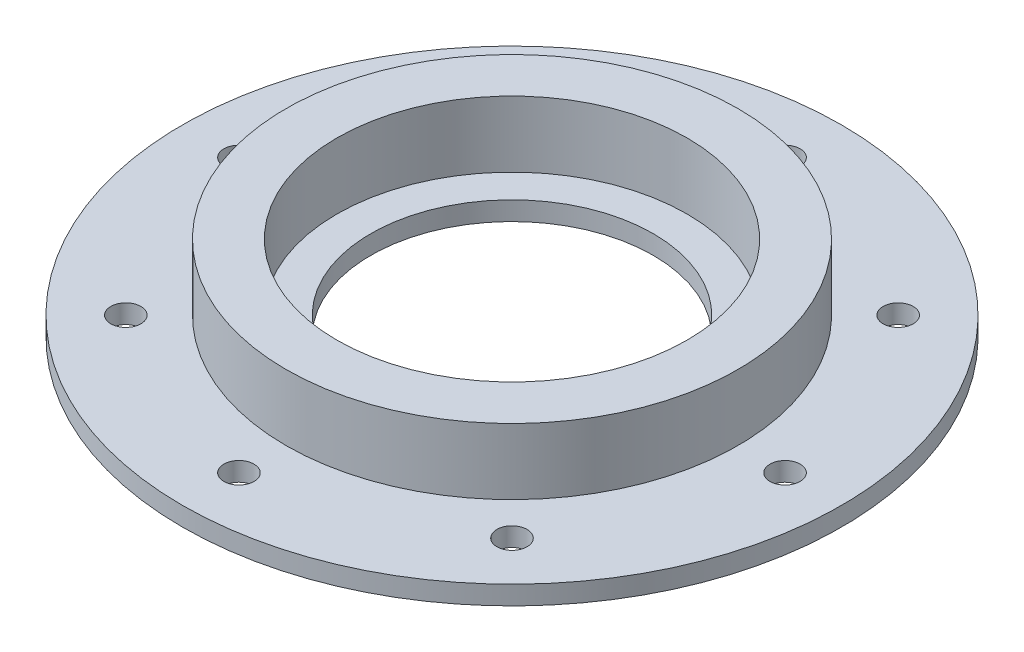
ISO-10303-21;
HEADER;
FILE_DESCRIPTION(('STEP AP214'),'2;1');
FILE_NAME('part.step','',(''),(''),'','','');
FILE_SCHEMA(('AUTOMOTIVE_DESIGN { 1 0 10303 214 1 1 1 1 }'));
ENDSEC;
DATA;
#1=APPLICATION_CONTEXT('core data for automotive mechanical design processes');
#2=APPLICATION_PROTOCOL_DEFINITION('international standard','automotive_design',2000,#1);
#3=PRODUCT_CONTEXT('',#1,'mechanical');
#4=PRODUCT('Part','Part','',(#3));
#5=PRODUCT_RELATED_PRODUCT_CATEGORY('part','',(#4));
#6=PRODUCT_DEFINITION_FORMATION('','',#4);
#7=PRODUCT_DEFINITION_CONTEXT('part definition',#1,'design');
#8=PRODUCT_DEFINITION('design','',#6,#7);
#9=PRODUCT_DEFINITION_SHAPE('','',#8);
#10=(LENGTH_UNIT() NAMED_UNIT(*) SI_UNIT(.MILLI.,.METRE.));
#11=(NAMED_UNIT(*) PLANE_ANGLE_UNIT() SI_UNIT($,.RADIAN.));
#12=(NAMED_UNIT(*) SI_UNIT($,.STERADIAN.) SOLID_ANGLE_UNIT());
#13=UNCERTAINTY_MEASURE_WITH_UNIT(LENGTH_MEASURE(1.E-05),#10,'distance_accuracy_value','');
#14=(GEOMETRIC_REPRESENTATION_CONTEXT(3) GLOBAL_UNCERTAINTY_ASSIGNED_CONTEXT((#13)) GLOBAL_UNIT_ASSIGNED_CONTEXT((#10,
#11,#12)) REPRESENTATION_CONTEXT('',''));
#15=CARTESIAN_POINT('',(0.,0.,0.));
#16=DIRECTION('',(0.,0.,1.));
#17=DIRECTION('',(1.,0.,0.));
#18=AXIS2_PLACEMENT_3D('',#15,#16,#17);
#19=CARTESIAN_POINT('',(0.,0.,0.));
#20=DIRECTION('',(0.,1.,0.));
#21=DIRECTION('',(0.,0.,1.));
#22=AXIS2_PLACEMENT_3D('',#19,#20,#21);
#23=PLANE('',#22);
#24=CARTESIAN_POINT('',(0.,0.,0.));
#25=DIRECTION('',(0.,1.,0.));
#26=DIRECTION('',(0.,0.,1.));
#27=AXIS2_PLACEMENT_3D('',#24,#25,#26);
#28=CIRCLE('',#27,15.);
#29=CARTESIAN_POINT('',(0.,0.,15.));
#30=VERTEX_POINT('',#29);
#31=EDGE_CURVE('E59',#30,#30,#28,.T.);
#32=ORIENTED_EDGE('',*,*,#31,.F.);
#33=EDGE_LOOP('',(#32));
#34=FACE_BOUND('',#33,.T.);
#35=CARTESIAN_POINT('',(0.,0.,0.));
#36=DIRECTION('',(0.,1.,0.));
#37=DIRECTION('',(0.,0.,1.));
#38=AXIS2_PLACEMENT_3D('',#35,#36,#37);
#39=CIRCLE('',#38,18.6);
#40=CARTESIAN_POINT('',(0.,0.,18.6));
#41=VERTEX_POINT('',#40);
#42=EDGE_CURVE('E10',#41,#41,#39,.F.);
#43=ORIENTED_EDGE('',*,*,#42,.F.);
#44=EDGE_LOOP('',(#43));
#45=FACE_BOUND('',#44,.T.);
#46=ADVANCED_FACE('F41',(#34,#45),#23,.T.);
#47=CARTESIAN_POINT('',(0.,-2.,0.));
#48=DIRECTION('',(0.,1.,0.));
#49=DIRECTION('',(0.,0.,1.));
#50=AXIS2_PLACEMENT_3D('',#47,#48,#49);
#51=CYLINDRICAL_SURFACE('',#50,35.);
#52=CARTESIAN_POINT('',(0.,-2.,0.));
#53=DIRECTION('',(0.,1.,0.));
#54=DIRECTION('',(0.,0.,1.));
#55=AXIS2_PLACEMENT_3D('',#52,#53,#54);
#56=CIRCLE('',#55,35.);
#57=CARTESIAN_POINT('',(0.,-2.,35.));
#58=VERTEX_POINT('',#57);
#59=EDGE_CURVE('E48',#58,#58,#56,.T.);
#60=ORIENTED_EDGE('',*,*,#59,.T.);
#61=EDGE_LOOP('',(#60));
#62=FACE_BOUND('',#61,.T.);
#63=CARTESIAN_POINT('',(0.,0.,0.));
#64=DIRECTION('',(0.,1.,0.));
#65=DIRECTION('',(0.,0.,1.));
#66=AXIS2_PLACEMENT_3D('',#63,#64,#65);
#67=CIRCLE('',#66,35.);
#68=CARTESIAN_POINT('',(0.,0.,35.));
#69=VERTEX_POINT('',#68);
#70=EDGE_CURVE('E52',#69,#69,#67,.T.);
#71=ORIENTED_EDGE('',*,*,#70,.F.);
#72=EDGE_LOOP('',(#71));
#73=FACE_BOUND('',#72,.T.);
#74=ADVANCED_FACE('F43',(#62,#73),#51,.T.);
#75=CARTESIAN_POINT('',(0.,-2.,0.));
#76=DIRECTION('',(0.,1.,0.));
#77=DIRECTION('',(0.,0.,1.));
#78=AXIS2_PLACEMENT_3D('',#75,#76,#77);
#79=PLANE('',#78);
#80=CARTESIAN_POINT('',(20.5060966544099,-2.,-20.5060966544099));
#81=DIRECTION('',(0.,1.,0.));
#82=DIRECTION('',(0.,0.,1.));
#83=AXIS2_PLACEMENT_3D('',#80,#81,#82);
#84=CIRCLE('',#83,1.6);
#85=CARTESIAN_POINT('',(20.5060966544099,-2.,-18.9060966544099));
#86=VERTEX_POINT('',#85);
#87=EDGE_CURVE('E104',#86,#86,#84,.T.);
#88=ORIENTED_EDGE('',*,*,#87,.T.);
#89=EDGE_LOOP('',(#88));
#90=FACE_BOUND('',#89,.T.);
#91=CARTESIAN_POINT('',(0.,-2.,-29.));
#92=DIRECTION('',(0.,1.,0.));
#93=DIRECTION('',(0.,0.,1.));
#94=AXIS2_PLACEMENT_3D('',#91,#92,#93);
#95=CIRCLE('',#94,1.6);
#96=CARTESIAN_POINT('',(0.,-2.,-27.4));
#97=VERTEX_POINT('',#96);
#98=EDGE_CURVE('E98',#97,#97,#95,.T.);
#99=ORIENTED_EDGE('',*,*,#98,.T.);
#100=EDGE_LOOP('',(#99));
#101=FACE_BOUND('',#100,.T.);
#102=CARTESIAN_POINT('',(-20.5060966544099,-2.,-20.5060966544099));
#103=DIRECTION('',(0.,1.,0.));
#104=DIRECTION('',(0.,0.,1.));
#105=AXIS2_PLACEMENT_3D('',#102,#103,#104);
#106=CIRCLE('',#105,1.6);
#107=CARTESIAN_POINT('',(-20.5060966544099,-2.,-18.9060966544099));
#108=VERTEX_POINT('',#107);
#109=EDGE_CURVE('E92',#108,#108,#106,.T.);
#110=ORIENTED_EDGE('',*,*,#109,.T.);
#111=EDGE_LOOP('',(#110));
#112=FACE_BOUND('',#111,.T.);
#113=CARTESIAN_POINT('',(-29.,-2.,0.));
#114=DIRECTION('',(0.,1.,0.));
#115=DIRECTION('',(0.,0.,1.));
#116=AXIS2_PLACEMENT_3D('',#113,#114,#115);
#117=CIRCLE('',#116,1.6);
#118=CARTESIAN_POINT('',(-29.,-2.,1.60000000000001));
#119=VERTEX_POINT('',#118);
#120=EDGE_CURVE('E86',#119,#119,#117,.T.);
#121=ORIENTED_EDGE('',*,*,#120,.T.);
#122=EDGE_LOOP('',(#121));
#123=FACE_BOUND('',#122,.T.);
#124=CARTESIAN_POINT('',(-20.5060966544099,-2.,20.5060966544099));
#125=DIRECTION('',(0.,1.,0.));
#126=DIRECTION('',(0.,0.,1.));
#127=AXIS2_PLACEMENT_3D('',#124,#125,#126);
#128=CIRCLE('',#127,1.6);
#129=CARTESIAN_POINT('',(-20.5060966544099,-2.,22.1060966544099));
#130=VERTEX_POINT('',#129);
#131=EDGE_CURVE('E80',#130,#130,#128,.T.);
#132=ORIENTED_EDGE('',*,*,#131,.T.);
#133=EDGE_LOOP('',(#132));
#134=FACE_BOUND('',#133,.T.);
#135=CARTESIAN_POINT('',(0.,-2.,29.));
#136=DIRECTION('',(0.,1.,0.));
#137=DIRECTION('',(0.,0.,1.));
#138=AXIS2_PLACEMENT_3D('',#135,#136,#137);
#139=CIRCLE('',#138,1.6);
#140=CARTESIAN_POINT('',(0.,-2.,30.6));
#141=VERTEX_POINT('',#140);
#142=EDGE_CURVE('E74',#141,#141,#139,.T.);
#143=ORIENTED_EDGE('',*,*,#142,.T.);
#144=EDGE_LOOP('',(#143));
#145=FACE_BOUND('',#144,.T.);
#146=CARTESIAN_POINT('',(20.5060966544099,-2.,20.5060966544099));
#147=DIRECTION('',(0.,1.,0.));
#148=DIRECTION('',(0.,0.,1.));
#149=AXIS2_PLACEMENT_3D('',#146,#147,#148);
#150=CIRCLE('',#149,1.6);
#151=CARTESIAN_POINT('',(20.5060966544099,-2.,22.1060966544099));
#152=VERTEX_POINT('',#151);
#153=EDGE_CURVE('E68',#152,#152,#150,.T.);
#154=ORIENTED_EDGE('',*,*,#153,.T.);
#155=EDGE_LOOP('',(#154));
#156=FACE_BOUND('',#155,.T.);
#157=CARTESIAN_POINT('',(29.,-2.,0.));
#158=DIRECTION('',(0.,1.,0.));
#159=DIRECTION('',(0.,0.,1.));
#160=AXIS2_PLACEMENT_3D('',#157,#158,#159);
#161=CIRCLE('',#160,1.6);
#162=CARTESIAN_POINT('',(29.,-2.,1.6));
#163=VERTEX_POINT('',#162);
#164=EDGE_CURVE('E62',#163,#163,#161,.T.);
#165=ORIENTED_EDGE('',*,*,#164,.T.);
#166=EDGE_LOOP('',(#165));
#167=FACE_BOUND('',#166,.T.);
#168=CARTESIAN_POINT('',(0.,-2.,0.));
#169=DIRECTION('',(0.,1.,0.));
#170=DIRECTION('',(0.,0.,1.));
#171=AXIS2_PLACEMENT_3D('',#168,#169,#170);
#172=CIRCLE('',#171,15.);
#173=CARTESIAN_POINT('',(0.,-2.,15.));
#174=VERTEX_POINT('',#173);
#175=EDGE_CURVE('E57',#174,#174,#172,.T.);
#176=ORIENTED_EDGE('',*,*,#175,.T.);
#177=EDGE_LOOP('',(#176));
#178=FACE_BOUND('',#177,.T.);
#179=ORIENTED_EDGE('',*,*,#59,.F.);
#180=EDGE_LOOP('',(#179));
#181=FACE_BOUND('',#180,.T.);
#182=ADVANCED_FACE('F146',(#90,#101,#112,#123,#134,#145,#156,#167,#178,#181),#79,.F.);
#183=CARTESIAN_POINT('',(0.,0.,0.));
#184=DIRECTION('',(0.,1.,0.));
#185=DIRECTION('',(0.,0.,1.));
#186=AXIS2_PLACEMENT_3D('',#183,#184,#185);
#187=CIRCLE('',#186,24.);
#188=CARTESIAN_POINT('',(0.,0.,24.));
#189=VERTEX_POINT('',#188);
#190=EDGE_CURVE('E113',#189,#189,#187,.T.);
#191=ORIENTED_EDGE('',*,*,#190,.F.);
#192=EDGE_LOOP('',(#191));
#193=FACE_BOUND('',#192,.T.);
#194=CARTESIAN_POINT('',(20.5060966544099,0.,-20.5060966544099));
#195=DIRECTION('',(0.,1.,0.));
#196=DIRECTION('',(0.,0.,1.));
#197=AXIS2_PLACEMENT_3D('',#194,#195,#196);
#198=CIRCLE('',#197,1.6);
#199=CARTESIAN_POINT('',(20.5060966544099,0.,-18.9060966544099));
#200=VERTEX_POINT('',#199);
#201=EDGE_CURVE('E107',#200,#200,#198,.T.);
#202=ORIENTED_EDGE('',*,*,#201,.F.);
#203=EDGE_LOOP('',(#202));
#204=FACE_BOUND('',#203,.T.);
#205=CARTESIAN_POINT('',(0.,0.,-29.));
#206=DIRECTION('',(0.,1.,0.));
#207=DIRECTION('',(0.,0.,1.));
#208=AXIS2_PLACEMENT_3D('',#205,#206,#207);
#209=CIRCLE('',#208,1.6);
#210=CARTESIAN_POINT('',(0.,0.,-27.4));
#211=VERTEX_POINT('',#210);
#212=EDGE_CURVE('E101',#211,#211,#209,.T.);
#213=ORIENTED_EDGE('',*,*,#212,.F.);
#214=EDGE_LOOP('',(#213));
#215=FACE_BOUND('',#214,.T.);
#216=CARTESIAN_POINT('',(-20.5060966544099,0.,-20.5060966544099));
#217=DIRECTION('',(0.,1.,0.));
#218=DIRECTION('',(0.,0.,1.));
#219=AXIS2_PLACEMENT_3D('',#216,#217,#218);
#220=CIRCLE('',#219,1.6);
#221=CARTESIAN_POINT('',(-20.5060966544099,0.,-18.9060966544099));
#222=VERTEX_POINT('',#221);
#223=EDGE_CURVE('E95',#222,#222,#220,.T.);
#224=ORIENTED_EDGE('',*,*,#223,.F.);
#225=EDGE_LOOP('',(#224));
#226=FACE_BOUND('',#225,.T.);
#227=CARTESIAN_POINT('',(-29.,0.,0.));
#228=DIRECTION('',(0.,1.,0.));
#229=DIRECTION('',(0.,0.,1.));
#230=AXIS2_PLACEMENT_3D('',#227,#228,#229);
#231=CIRCLE('',#230,1.6);
#232=CARTESIAN_POINT('',(-29.,0.,1.60000000000001));
#233=VERTEX_POINT('',#232);
#234=EDGE_CURVE('E89',#233,#233,#231,.T.);
#235=ORIENTED_EDGE('',*,*,#234,.F.);
#236=EDGE_LOOP('',(#235));
#237=FACE_BOUND('',#236,.T.);
#238=CARTESIAN_POINT('',(-20.5060966544099,0.,20.5060966544099));
#239=DIRECTION('',(0.,1.,0.));
#240=DIRECTION('',(0.,0.,1.));
#241=AXIS2_PLACEMENT_3D('',#238,#239,#240);
#242=CIRCLE('',#241,1.6);
#243=CARTESIAN_POINT('',(-20.5060966544099,0.,22.1060966544099));
#244=VERTEX_POINT('',#243);
#245=EDGE_CURVE('E83',#244,#244,#242,.T.);
#246=ORIENTED_EDGE('',*,*,#245,.F.);
#247=EDGE_LOOP('',(#246));
#248=FACE_BOUND('',#247,.T.);
#249=CARTESIAN_POINT('',(0.,0.,29.));
#250=DIRECTION('',(0.,1.,0.));
#251=DIRECTION('',(0.,0.,1.));
#252=AXIS2_PLACEMENT_3D('',#249,#250,#251);
#253=CIRCLE('',#252,1.6);
#254=CARTESIAN_POINT('',(0.,0.,30.6));
#255=VERTEX_POINT('',#254);
#256=EDGE_CURVE('E77',#255,#255,#253,.T.);
#257=ORIENTED_EDGE('',*,*,#256,.F.);
#258=EDGE_LOOP('',(#257));
#259=FACE_BOUND('',#258,.T.);
#260=CARTESIAN_POINT('',(20.5060966544099,0.,20.5060966544099));
#261=DIRECTION('',(0.,1.,0.));
#262=DIRECTION('',(0.,0.,1.));
#263=AXIS2_PLACEMENT_3D('',#260,#261,#262);
#264=CIRCLE('',#263,1.6);
#265=CARTESIAN_POINT('',(20.5060966544099,0.,22.1060966544099));
#266=VERTEX_POINT('',#265);
#267=EDGE_CURVE('E71',#266,#266,#264,.T.);
#268=ORIENTED_EDGE('',*,*,#267,.F.);
#269=EDGE_LOOP('',(#268));
#270=FACE_BOUND('',#269,.T.);
#271=CARTESIAN_POINT('',(29.,0.,0.));
#272=DIRECTION('',(0.,1.,0.));
#273=DIRECTION('',(0.,0.,1.));
#274=AXIS2_PLACEMENT_3D('',#271,#272,#273);
#275=CIRCLE('',#274,1.6);
#276=CARTESIAN_POINT('',(29.,0.,1.6));
#277=VERTEX_POINT('',#276);
#278=EDGE_CURVE('E65',#277,#277,#275,.T.);
#279=ORIENTED_EDGE('',*,*,#278,.F.);
#280=EDGE_LOOP('',(#279));
#281=FACE_BOUND('',#280,.T.);
#282=ORIENTED_EDGE('',*,*,#70,.T.);
#283=EDGE_LOOP('',(#282));
#284=FACE_BOUND('',#283,.T.);
#285=ADVANCED_FACE('F142',(#193,#204,#215,#226,#237,#248,#259,#270,#281,#284),#23,.T.);
#286=CARTESIAN_POINT('',(0.,-2.,0.));
#287=DIRECTION('',(0.,1.,0.));
#288=DIRECTION('',(0.,0.,1.));
#289=AXIS2_PLACEMENT_3D('',#286,#287,#288);
#290=CYLINDRICAL_SURFACE('',#289,15.);
#291=ORIENTED_EDGE('',*,*,#175,.F.);
#292=EDGE_LOOP('',(#291));
#293=FACE_BOUND('',#292,.T.);
#294=ORIENTED_EDGE('',*,*,#31,.T.);
#295=EDGE_LOOP('',(#294));
#296=FACE_BOUND('',#295,.T.);
#297=ADVANCED_FACE('F151',(#293,#296),#290,.F.);
#298=CARTESIAN_POINT('',(29.,-2.,0.));
#299=DIRECTION('',(0.,1.,0.));
#300=DIRECTION('',(0.,0.,1.));
#301=AXIS2_PLACEMENT_3D('',#298,#299,#300);
#302=CYLINDRICAL_SURFACE('',#301,1.6);
#303=ORIENTED_EDGE('',*,*,#164,.F.);
#304=EDGE_LOOP('',(#303));
#305=FACE_BOUND('',#304,.T.);
#306=ORIENTED_EDGE('',*,*,#278,.T.);
#307=EDGE_LOOP('',(#306));
#308=FACE_BOUND('',#307,.T.);
#309=ADVANCED_FACE('F157',(#305,#308),#302,.F.);
#310=CARTESIAN_POINT('',(20.5060966544099,-2.,20.5060966544099));
#311=DIRECTION('',(0.,1.,0.));
#312=DIRECTION('',(0.,0.,1.));
#313=AXIS2_PLACEMENT_3D('',#310,#311,#312);
#314=CYLINDRICAL_SURFACE('',#313,1.6);
#315=ORIENTED_EDGE('',*,*,#153,.F.);
#316=EDGE_LOOP('',(#315));
#317=FACE_BOUND('',#316,.T.);
#318=ORIENTED_EDGE('',*,*,#267,.T.);
#319=EDGE_LOOP('',(#318));
#320=FACE_BOUND('',#319,.T.);
#321=ADVANCED_FACE('F183',(#317,#320),#314,.F.);
#322=CARTESIAN_POINT('',(0.,-2.,29.));
#323=DIRECTION('',(0.,1.,0.));
#324=DIRECTION('',(0.,0.,1.));
#325=AXIS2_PLACEMENT_3D('',#322,#323,#324);
#326=CYLINDRICAL_SURFACE('',#325,1.6);
#327=ORIENTED_EDGE('',*,*,#142,.F.);
#328=EDGE_LOOP('',(#327));
#329=FACE_BOUND('',#328,.T.);
#330=ORIENTED_EDGE('',*,*,#256,.T.);
#331=EDGE_LOOP('',(#330));
#332=FACE_BOUND('',#331,.T.);
#333=ADVANCED_FACE('F189',(#329,#332),#326,.F.);
#334=CARTESIAN_POINT('',(-20.5060966544099,-2.,20.5060966544099));
#335=DIRECTION('',(0.,1.,0.));
#336=DIRECTION('',(0.,0.,1.));
#337=AXIS2_PLACEMENT_3D('',#334,#335,#336);
#338=CYLINDRICAL_SURFACE('',#337,1.6);
#339=ORIENTED_EDGE('',*,*,#131,.F.);
#340=EDGE_LOOP('',(#339));
#341=FACE_BOUND('',#340,.T.);
#342=ORIENTED_EDGE('',*,*,#245,.T.);
#343=EDGE_LOOP('',(#342));
#344=FACE_BOUND('',#343,.T.);
#345=ADVANCED_FACE('F196',(#341,#344),#338,.F.);
#346=CARTESIAN_POINT('',(-29.,-2.,0.));
#347=DIRECTION('',(0.,1.,0.));
#348=DIRECTION('',(0.,0.,1.));
#349=AXIS2_PLACEMENT_3D('',#346,#347,#348);
#350=CYLINDRICAL_SURFACE('',#349,1.6);
#351=ORIENTED_EDGE('',*,*,#120,.F.);
#352=EDGE_LOOP('',(#351));
#353=FACE_BOUND('',#352,.T.);
#354=ORIENTED_EDGE('',*,*,#234,.T.);
#355=EDGE_LOOP('',(#354));
#356=FACE_BOUND('',#355,.T.);
#357=ADVANCED_FACE('F200',(#353,#356),#350,.F.);
#358=CARTESIAN_POINT('',(-20.5060966544099,-2.,-20.5060966544099));
#359=DIRECTION('',(0.,1.,0.));
#360=DIRECTION('',(0.,0.,1.));
#361=AXIS2_PLACEMENT_3D('',#358,#359,#360);
#362=CYLINDRICAL_SURFACE('',#361,1.6);
#363=ORIENTED_EDGE('',*,*,#109,.F.);
#364=EDGE_LOOP('',(#363));
#365=FACE_BOUND('',#364,.T.);
#366=ORIENTED_EDGE('',*,*,#223,.T.);
#367=EDGE_LOOP('',(#366));
#368=FACE_BOUND('',#367,.T.);
#369=ADVANCED_FACE('F204',(#365,#368),#362,.F.);
#370=CARTESIAN_POINT('',(0.,-2.,-29.));
#371=DIRECTION('',(0.,1.,0.));
#372=DIRECTION('',(0.,0.,1.));
#373=AXIS2_PLACEMENT_3D('',#370,#371,#372);
#374=CYLINDRICAL_SURFACE('',#373,1.6);
#375=ORIENTED_EDGE('',*,*,#98,.F.);
#376=EDGE_LOOP('',(#375));
#377=FACE_BOUND('',#376,.T.);
#378=ORIENTED_EDGE('',*,*,#212,.T.);
#379=EDGE_LOOP('',(#378));
#380=FACE_BOUND('',#379,.T.);
#381=ADVANCED_FACE('F136',(#377,#380),#374,.F.);
#382=CARTESIAN_POINT('',(20.5060966544099,-2.,-20.5060966544099));
#383=DIRECTION('',(0.,1.,0.));
#384=DIRECTION('',(0.,0.,1.));
#385=AXIS2_PLACEMENT_3D('',#382,#383,#384);
#386=CYLINDRICAL_SURFACE('',#385,1.6);
#387=ORIENTED_EDGE('',*,*,#87,.F.);
#388=EDGE_LOOP('',(#387));
#389=FACE_BOUND('',#388,.T.);
#390=ORIENTED_EDGE('',*,*,#201,.T.);
#391=EDGE_LOOP('',(#390));
#392=FACE_BOUND('',#391,.T.);
#393=ADVANCED_FACE('F127',(#389,#392),#386,.F.);
#394=CARTESIAN_POINT('',(0.,7.,0.));
#395=DIRECTION('',(0.,1.,0.));
#396=DIRECTION('',(0.,0.,1.));
#397=AXIS2_PLACEMENT_3D('',#394,#395,#396);
#398=PLANE('',#397);
#399=CARTESIAN_POINT('',(0.,7.,0.));
#400=DIRECTION('',(0.,1.,0.));
#401=DIRECTION('',(0.,0.,1.));
#402=AXIS2_PLACEMENT_3D('',#399,#400,#401);
#403=CIRCLE('',#402,24.);
#404=CARTESIAN_POINT('',(0.,7.,24.));
#405=VERTEX_POINT('',#404);
#406=EDGE_CURVE('E110',#405,#405,#403,.T.);
#407=ORIENTED_EDGE('',*,*,#406,.T.);
#408=EDGE_LOOP('',(#407));
#409=FACE_BOUND('',#408,.T.);
#410=CARTESIAN_POINT('',(0.,7.,0.));
#411=DIRECTION('',(0.,1.,0.));
#412=DIRECTION('',(0.,0.,1.));
#413=AXIS2_PLACEMENT_3D('',#410,#411,#412);
#414=CIRCLE('',#413,18.6);
#415=CARTESIAN_POINT('',(0.,7.,18.6));
#416=VERTEX_POINT('',#415);
#417=EDGE_CURVE('E116',#416,#416,#414,.T.);
#418=ORIENTED_EDGE('',*,*,#417,.F.);
#419=EDGE_LOOP('',(#418));
#420=FACE_BOUND('',#419,.T.);
#421=ADVANCED_FACE('F124',(#409,#420),#398,.T.);
#422=CARTESIAN_POINT('',(0.,7.,0.));
#423=DIRECTION('',(0.,-1.,0.));
#424=DIRECTION('',(0.,0.,-1.));
#425=AXIS2_PLACEMENT_3D('',#422,#423,#424);
#426=CYLINDRICAL_SURFACE('',#425,24.);
#427=ORIENTED_EDGE('',*,*,#406,.F.);
#428=EDGE_LOOP('',(#427));
#429=FACE_BOUND('',#428,.T.);
#430=ORIENTED_EDGE('',*,*,#190,.T.);
#431=EDGE_LOOP('',(#430));
#432=FACE_BOUND('',#431,.T.);
#433=ADVANCED_FACE('F126',(#429,#432),#426,.T.);
#434=CARTESIAN_POINT('',(0.,7.,0.));
#435=DIRECTION('',(0.,-1.,0.));
#436=DIRECTION('',(0.,0.,-1.));
#437=AXIS2_PLACEMENT_3D('',#434,#435,#436);
#438=CYLINDRICAL_SURFACE('',#437,18.6);
#439=ORIENTED_EDGE('',*,*,#417,.T.);
#440=EDGE_LOOP('',(#439));
#441=FACE_BOUND('',#440,.T.);
#442=ORIENTED_EDGE('',*,*,#42,.T.);
#443=EDGE_LOOP('',(#442));
#444=FACE_BOUND('',#443,.T.);
#445=ADVANCED_FACE('F122',(#441,#444),#438,.F.);
#446=CLOSED_SHELL('',(#46,#74,#182,#285,#297,#309,#321,#333,#345,#357,#369,#381,#393,#421,#433,#445));
#447=MANIFOLD_SOLID_BREP('B2',#446);
#448=ADVANCED_BREP_SHAPE_REPRESENTATION('',(#18,#447),#14);
#449=SHAPE_DEFINITION_REPRESENTATION(#9,#448);
ENDSEC;
END-ISO-10303-21;
